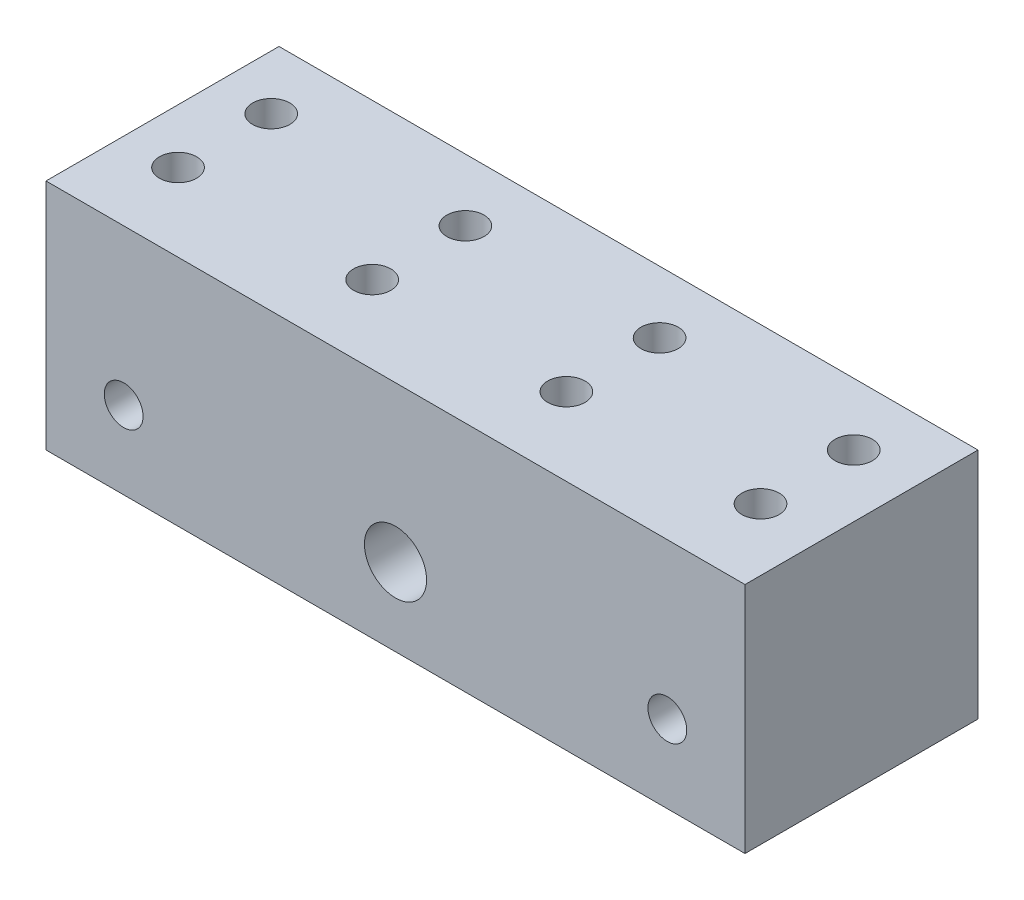
ISO-10303-21;
HEADER;
FILE_DESCRIPTION(('STEP AP214'),'2;1');
FILE_NAME('part.step','',(''),(''),'','','');
FILE_SCHEMA(('AUTOMOTIVE_DESIGN { 1 0 10303 214 1 1 1 1 }'));
ENDSEC;
DATA;
#1=APPLICATION_CONTEXT('core data for automotive mechanical design processes');
#2=APPLICATION_PROTOCOL_DEFINITION('international standard','automotive_design',2000,#1);
#3=PRODUCT_CONTEXT('',#1,'mechanical');
#4=PRODUCT('Part','Part','',(#3));
#5=PRODUCT_RELATED_PRODUCT_CATEGORY('part','',(#4));
#6=PRODUCT_DEFINITION_FORMATION('','',#4);
#7=PRODUCT_DEFINITION_CONTEXT('part definition',#1,'design');
#8=PRODUCT_DEFINITION('design','',#6,#7);
#9=PRODUCT_DEFINITION_SHAPE('','',#8);
#10=(LENGTH_UNIT() NAMED_UNIT(*) SI_UNIT(.MILLI.,.METRE.));
#11=(NAMED_UNIT(*) PLANE_ANGLE_UNIT() SI_UNIT($,.RADIAN.));
#12=(NAMED_UNIT(*) SI_UNIT($,.STERADIAN.) SOLID_ANGLE_UNIT());
#13=UNCERTAINTY_MEASURE_WITH_UNIT(LENGTH_MEASURE(1.E-05),#10,'distance_accuracy_value','');
#14=(GEOMETRIC_REPRESENTATION_CONTEXT(3) GLOBAL_UNCERTAINTY_ASSIGNED_CONTEXT((#13)) GLOBAL_UNIT_ASSIGNED_CONTEXT((#10,
#11,#12)) REPRESENTATION_CONTEXT('',''));
#15=CARTESIAN_POINT('',(0.,0.,0.));
#16=DIRECTION('',(0.,0.,1.));
#17=DIRECTION('',(1.,0.,0.));
#18=AXIS2_PLACEMENT_3D('',#15,#16,#17);
#19=CARTESIAN_POINT('',(0.,0.,30.));
#20=DIRECTION('',(0.,0.,-1.));
#21=DIRECTION('',(-1.,0.,0.));
#22=AXIS2_PLACEMENT_3D('',#19,#20,#21);
#23=PLANE('',#22);
#24=DIRECTION('',(0.,-1.,0.));
#25=VECTOR('',#24,1.);
#26=CARTESIAN_POINT('',(0.,0.,30.));
#27=LINE('',#26,#25);
#28=CARTESIAN_POINT('',(0.,30.,30.));
#29=VERTEX_POINT('',#28);
#30=CARTESIAN_POINT('',(0.,0.,30.));
#31=VERTEX_POINT('',#30);
#32=EDGE_CURVE('E94',#29,#31,#27,.T.);
#33=ORIENTED_EDGE('',*,*,#32,.T.);
#34=DIRECTION('',(1.,0.,0.));
#35=VECTOR('',#34,1.);
#36=CARTESIAN_POINT('',(0.,0.,30.));
#37=LINE('',#36,#35);
#38=CARTESIAN_POINT('',(90.,0.,30.));
#39=VERTEX_POINT('',#38);
#40=EDGE_CURVE('E89',#31,#39,#37,.T.);
#41=ORIENTED_EDGE('',*,*,#40,.T.);
#42=DIRECTION('',(0.,1.,0.));
#43=VECTOR('',#42,1.);
#44=CARTESIAN_POINT('',(90.,0.,30.));
#45=LINE('',#44,#43);
#46=CARTESIAN_POINT('',(90.,30.,30.));
#47=VERTEX_POINT('',#46);
#48=EDGE_CURVE('E92',#39,#47,#45,.T.);
#49=ORIENTED_EDGE('',*,*,#48,.T.);
#50=DIRECTION('',(-1.,0.,0.));
#51=VECTOR('',#50,1.);
#52=CARTESIAN_POINT('',(0.,30.,30.));
#53=LINE('',#52,#51);
#54=EDGE_CURVE('E59',#47,#29,#53,.T.);
#55=ORIENTED_EDGE('',*,*,#54,.T.);
#56=EDGE_LOOP('',(#33,#41,#49,#55));
#57=FACE_BOUND('',#56,.T.);
#58=CARTESIAN_POINT('',(10.,10.,30.));
#59=DIRECTION('',(0.,0.,1.));
#60=DIRECTION('',(1.,0.,0.));
#61=AXIS2_PLACEMENT_3D('',#58,#59,#60);
#62=CIRCLE('',#61,2.5);
#63=CARTESIAN_POINT('',(12.5,10.,30.));
#64=VERTEX_POINT('',#63);
#65=EDGE_CURVE('E114',#64,#64,#62,.T.);
#66=ORIENTED_EDGE('',*,*,#65,.F.);
#67=EDGE_LOOP('',(#66));
#68=FACE_BOUND('',#67,.T.);
#69=CARTESIAN_POINT('',(45.,10.,30.));
#70=DIRECTION('',(0.,0.,1.));
#71=DIRECTION('',(1.,0.,0.));
#72=AXIS2_PLACEMENT_3D('',#69,#70,#71);
#73=CIRCLE('',#72,4.00000000000001);
#74=CARTESIAN_POINT('',(49.,10.,30.));
#75=VERTEX_POINT('',#74);
#76=EDGE_CURVE('E136',#75,#75,#73,.T.);
#77=ORIENTED_EDGE('',*,*,#76,.F.);
#78=EDGE_LOOP('',(#77));
#79=FACE_BOUND('',#78,.T.);
#80=CARTESIAN_POINT('',(80.,10.,30.));
#81=DIRECTION('',(0.,0.,1.));
#82=DIRECTION('',(1.,0.,0.));
#83=AXIS2_PLACEMENT_3D('',#80,#81,#82);
#84=CIRCLE('',#83,2.50000000000001);
#85=CARTESIAN_POINT('',(82.5,10.,30.));
#86=VERTEX_POINT('',#85);
#87=EDGE_CURVE('E144',#86,#86,#84,.T.);
#88=ORIENTED_EDGE('',*,*,#87,.F.);
#89=EDGE_LOOP('',(#88));
#90=FACE_BOUND('',#89,.T.);
#91=ADVANCED_FACE('F41',(#57,#68,#79,#90),#23,.F.);
#92=CARTESIAN_POINT('',(0.,0.,0.));
#93=DIRECTION('',(0.,0.,-1.));
#94=DIRECTION('',(-1.,0.,0.));
#95=AXIS2_PLACEMENT_3D('',#92,#93,#94);
#96=PLANE('',#95);
#97=CARTESIAN_POINT('',(45.,10.,0.));
#98=DIRECTION('',(0.,0.,1.));
#99=DIRECTION('',(1.,0.,0.));
#100=AXIS2_PLACEMENT_3D('',#97,#98,#99);
#101=CIRCLE('',#100,4.00000000000001);
#102=CARTESIAN_POINT('',(49.,10.,0.));
#103=VERTEX_POINT('',#102);
#104=EDGE_CURVE('E140',#103,#103,#101,.T.);
#105=ORIENTED_EDGE('',*,*,#104,.T.);
#106=EDGE_LOOP('',(#105));
#107=FACE_BOUND('',#106,.T.);
#108=DIRECTION('',(0.,-1.,0.));
#109=VECTOR('',#108,1.);
#110=CARTESIAN_POINT('',(0.,0.,0.));
#111=LINE('',#110,#109);
#112=CARTESIAN_POINT('',(0.,30.,0.));
#113=VERTEX_POINT('',#112);
#114=CARTESIAN_POINT('',(0.,0.,0.));
#115=VERTEX_POINT('',#114);
#116=EDGE_CURVE('E110',#113,#115,#111,.T.);
#117=ORIENTED_EDGE('',*,*,#116,.F.);
#118=DIRECTION('',(-1.,0.,0.));
#119=VECTOR('',#118,1.);
#120=CARTESIAN_POINT('',(0.,30.,0.));
#121=LINE('',#120,#119);
#122=CARTESIAN_POINT('',(90.,30.,0.));
#123=VERTEX_POINT('',#122);
#124=EDGE_CURVE('E82',#123,#113,#121,.T.);
#125=ORIENTED_EDGE('',*,*,#124,.F.);
#126=DIRECTION('',(0.,1.,0.));
#127=VECTOR('',#126,1.);
#128=CARTESIAN_POINT('',(90.,0.,0.));
#129=LINE('',#128,#127);
#130=CARTESIAN_POINT('',(90.,0.,0.));
#131=VERTEX_POINT('',#130);
#132=EDGE_CURVE('E76',#131,#123,#129,.T.);
#133=ORIENTED_EDGE('',*,*,#132,.F.);
#134=DIRECTION('',(1.,0.,0.));
#135=VECTOR('',#134,1.);
#136=CARTESIAN_POINT('',(0.,0.,0.));
#137=LINE('',#136,#135);
#138=EDGE_CURVE('E99',#115,#131,#137,.T.);
#139=ORIENTED_EDGE('',*,*,#138,.F.);
#140=EDGE_LOOP('',(#117,#125,#133,#139));
#141=FACE_BOUND('',#140,.T.);
#142=CARTESIAN_POINT('',(10.,10.,0.));
#143=DIRECTION('',(0.,0.,1.));
#144=DIRECTION('',(1.,0.,0.));
#145=AXIS2_PLACEMENT_3D('',#142,#143,#144);
#146=CIRCLE('',#145,2.5);
#147=CARTESIAN_POINT('',(12.5,10.,0.));
#148=VERTEX_POINT('',#147);
#149=EDGE_CURVE('E132',#148,#148,#146,.T.);
#150=ORIENTED_EDGE('',*,*,#149,.T.);
#151=EDGE_LOOP('',(#150));
#152=FACE_BOUND('',#151,.T.);
#153=CARTESIAN_POINT('',(80.,10.,0.));
#154=DIRECTION('',(0.,0.,1.));
#155=DIRECTION('',(1.,0.,0.));
#156=AXIS2_PLACEMENT_3D('',#153,#154,#155);
#157=CIRCLE('',#156,2.50000000000001);
#158=CARTESIAN_POINT('',(82.5,10.,0.));
#159=VERTEX_POINT('',#158);
#160=EDGE_CURVE('E148',#159,#159,#157,.T.);
#161=ORIENTED_EDGE('',*,*,#160,.T.);
#162=EDGE_LOOP('',(#161));
#163=FACE_BOUND('',#162,.T.);
#164=ADVANCED_FACE('F127',(#107,#141,#152,#163),#96,.T.);
#165=CARTESIAN_POINT('',(0.,0.,30.));
#166=DIRECTION('',(1.,0.,0.));
#167=DIRECTION('',(0.,0.,-1.));
#168=AXIS2_PLACEMENT_3D('',#165,#166,#167);
#169=PLANE('',#168);
#170=ORIENTED_EDGE('',*,*,#116,.T.);
#171=DIRECTION('',(0.,0.,-1.));
#172=VECTOR('',#171,1.);
#173=CARTESIAN_POINT('',(0.,0.,30.));
#174=LINE('',#173,#172);
#175=EDGE_CURVE('E11',#31,#115,#174,.T.);
#176=ORIENTED_EDGE('',*,*,#175,.F.);
#177=ORIENTED_EDGE('',*,*,#32,.F.);
#178=DIRECTION('',(0.,0.,-1.));
#179=VECTOR('',#178,1.);
#180=CARTESIAN_POINT('',(0.,30.,30.));
#181=LINE('',#180,#179);
#182=EDGE_CURVE('E106',#29,#113,#181,.T.);
#183=ORIENTED_EDGE('',*,*,#182,.T.);
#184=EDGE_LOOP('',(#170,#176,#177,#183));
#185=FACE_BOUND('',#184,.T.);
#186=ADVANCED_FACE('F43',(#185),#169,.F.);
#187=CARTESIAN_POINT('',(0.,0.,30.));
#188=DIRECTION('',(0.,1.,0.));
#189=DIRECTION('',(0.,0.,1.));
#190=AXIS2_PLACEMENT_3D('',#187,#188,#189);
#191=PLANE('',#190);
#192=ORIENTED_EDGE('',*,*,#138,.T.);
#193=DIRECTION('',(0.,0.,-1.));
#194=VECTOR('',#193,1.);
#195=CARTESIAN_POINT('',(90.,0.,30.));
#196=LINE('',#195,#194);
#197=EDGE_CURVE('E51',#39,#131,#196,.T.);
#198=ORIENTED_EDGE('',*,*,#197,.F.);
#199=ORIENTED_EDGE('',*,*,#40,.F.);
#200=ORIENTED_EDGE('',*,*,#175,.T.);
#201=EDGE_LOOP('',(#192,#198,#199,#200));
#202=FACE_BOUND('',#201,.T.);
#203=ADVANCED_FACE('F98',(#202),#191,.F.);
#204=CARTESIAN_POINT('',(90.,0.,30.));
#205=DIRECTION('',(-1.,0.,0.));
#206=DIRECTION('',(0.,0.,1.));
#207=AXIS2_PLACEMENT_3D('',#204,#205,#206);
#208=PLANE('',#207);
#209=ORIENTED_EDGE('',*,*,#132,.T.);
#210=DIRECTION('',(0.,0.,-1.));
#211=VECTOR('',#210,1.);
#212=CARTESIAN_POINT('',(90.,30.,30.));
#213=LINE('',#212,#211);
#214=EDGE_CURVE('E101',#47,#123,#213,.T.);
#215=ORIENTED_EDGE('',*,*,#214,.F.);
#216=ORIENTED_EDGE('',*,*,#48,.F.);
#217=ORIENTED_EDGE('',*,*,#197,.T.);
#218=EDGE_LOOP('',(#209,#215,#216,#217));
#219=FACE_BOUND('',#218,.T.);
#220=ADVANCED_FACE('F102',(#219),#208,.F.);
#221=CARTESIAN_POINT('',(0.,30.,30.));
#222=DIRECTION('',(0.,-1.,0.));
#223=DIRECTION('',(0.,0.,-1.));
#224=AXIS2_PLACEMENT_3D('',#221,#222,#223);
#225=PLANE('',#224);
#226=CARTESIAN_POINT('',(32.,30.,20.));
#227=DIRECTION('',(0.,1.,0.));
#228=DIRECTION('',(0.,0.,1.));
#229=AXIS2_PLACEMENT_3D('',#226,#227,#228);
#230=CIRCLE('',#229,2.4);
#231=CARTESIAN_POINT('',(32.,30.,22.4));
#232=VERTEX_POINT('',#231);
#233=EDGE_CURVE('E180',#232,#232,#230,.T.);
#234=ORIENTED_EDGE('',*,*,#233,.F.);
#235=EDGE_LOOP('',(#234));
#236=FACE_BOUND('',#235,.T.);
#237=CARTESIAN_POINT('',(82.,30.,8.));
#238=DIRECTION('',(0.,1.,0.));
#239=DIRECTION('',(0.,0.,1.));
#240=AXIS2_PLACEMENT_3D('',#237,#238,#239);
#241=CIRCLE('',#240,2.4);
#242=CARTESIAN_POINT('',(82.,30.,10.4));
#243=VERTEX_POINT('',#242);
#244=EDGE_CURVE('E189',#243,#243,#241,.T.);
#245=ORIENTED_EDGE('',*,*,#244,.F.);
#246=EDGE_LOOP('',(#245));
#247=FACE_BOUND('',#246,.T.);
#248=CARTESIAN_POINT('',(57.,30.,8.));
#249=DIRECTION('',(0.,1.,0.));
#250=DIRECTION('',(0.,0.,1.));
#251=AXIS2_PLACEMENT_3D('',#248,#249,#250);
#252=CIRCLE('',#251,2.4);
#253=CARTESIAN_POINT('',(57.,30.,10.4));
#254=VERTEX_POINT('',#253);
#255=EDGE_CURVE('E164',#254,#254,#252,.T.);
#256=ORIENTED_EDGE('',*,*,#255,.F.);
#257=EDGE_LOOP('',(#256));
#258=FACE_BOUND('',#257,.T.);
#259=CARTESIAN_POINT('',(32.,30.,8.));
#260=DIRECTION('',(0.,1.,0.));
#261=DIRECTION('',(0.,0.,1.));
#262=AXIS2_PLACEMENT_3D('',#259,#260,#261);
#263=CIRCLE('',#262,2.4);
#264=CARTESIAN_POINT('',(32.,30.,10.4));
#265=VERTEX_POINT('',#264);
#266=EDGE_CURVE('E173',#265,#265,#263,.T.);
#267=ORIENTED_EDGE('',*,*,#266,.F.);
#268=EDGE_LOOP('',(#267));
#269=FACE_BOUND('',#268,.T.);
#270=CARTESIAN_POINT('',(57.,30.,20.));
#271=DIRECTION('',(0.,1.,0.));
#272=DIRECTION('',(0.,0.,1.));
#273=AXIS2_PLACEMENT_3D('',#270,#271,#272);
#274=CIRCLE('',#273,2.4);
#275=CARTESIAN_POINT('',(57.,30.,22.4));
#276=VERTEX_POINT('',#275);
#277=EDGE_CURVE('E212',#276,#276,#274,.T.);
#278=ORIENTED_EDGE('',*,*,#277,.F.);
#279=EDGE_LOOP('',(#278));
#280=FACE_BOUND('',#279,.T.);
#281=CARTESIAN_POINT('',(82.,30.,20.));
#282=DIRECTION('',(0.,1.,0.));
#283=DIRECTION('',(0.,0.,1.));
#284=AXIS2_PLACEMENT_3D('',#281,#282,#283);
#285=CIRCLE('',#284,2.4);
#286=CARTESIAN_POINT('',(82.,30.,22.4));
#287=VERTEX_POINT('',#286);
#288=EDGE_CURVE('E204',#287,#287,#285,.T.);
#289=ORIENTED_EDGE('',*,*,#288,.F.);
#290=EDGE_LOOP('',(#289));
#291=FACE_BOUND('',#290,.T.);
#292=CARTESIAN_POINT('',(7.00000000000001,30.,20.));
#293=DIRECTION('',(0.,1.,0.));
#294=DIRECTION('',(0.,0.,1.));
#295=AXIS2_PLACEMENT_3D('',#292,#293,#294);
#296=CIRCLE('',#295,2.4);
#297=CARTESIAN_POINT('',(7.00000000000001,30.,22.4));
#298=VERTEX_POINT('',#297);
#299=EDGE_CURVE('E196',#298,#298,#296,.T.);
#300=ORIENTED_EDGE('',*,*,#299,.F.);
#301=EDGE_LOOP('',(#300));
#302=FACE_BOUND('',#301,.T.);
#303=CARTESIAN_POINT('',(7.00000000000001,30.,8.));
#304=DIRECTION('',(0.,1.,0.));
#305=DIRECTION('',(0.,0.,1.));
#306=AXIS2_PLACEMENT_3D('',#303,#304,#305);
#307=CIRCLE('',#306,2.4);
#308=CARTESIAN_POINT('',(7.00000000000001,30.,10.4));
#309=VERTEX_POINT('',#308);
#310=EDGE_CURVE('E156',#309,#309,#307,.T.);
#311=ORIENTED_EDGE('',*,*,#310,.F.);
#312=EDGE_LOOP('',(#311));
#313=FACE_BOUND('',#312,.T.);
#314=ORIENTED_EDGE('',*,*,#124,.T.);
#315=ORIENTED_EDGE('',*,*,#182,.F.);
#316=ORIENTED_EDGE('',*,*,#54,.F.);
#317=ORIENTED_EDGE('',*,*,#214,.T.);
#318=EDGE_LOOP('',(#314,#315,#316,#317));
#319=FACE_BOUND('',#318,.T.);
#320=ADVANCED_FACE('F124',(#236,#247,#258,#269,#280,#291,#302,#313,#319),#225,.F.);
#321=CARTESIAN_POINT('',(10.,10.,30.));
#322=DIRECTION('',(0.,0.,-1.));
#323=DIRECTION('',(-1.,0.,0.));
#324=AXIS2_PLACEMENT_3D('',#321,#322,#323);
#325=CYLINDRICAL_SURFACE('',#324,2.5);
#326=ORIENTED_EDGE('',*,*,#65,.T.);
#327=EDGE_LOOP('',(#326));
#328=FACE_BOUND('',#327,.T.);
#329=ORIENTED_EDGE('',*,*,#149,.F.);
#330=EDGE_LOOP('',(#329));
#331=FACE_BOUND('',#330,.T.);
#332=ADVANCED_FACE('F231',(#328,#331),#325,.F.);
#333=CARTESIAN_POINT('',(45.,10.,30.));
#334=DIRECTION('',(0.,0.,-1.));
#335=DIRECTION('',(-1.,0.,0.));
#336=AXIS2_PLACEMENT_3D('',#333,#334,#335);
#337=CYLINDRICAL_SURFACE('',#336,4.00000000000001);
#338=ORIENTED_EDGE('',*,*,#76,.T.);
#339=EDGE_LOOP('',(#338));
#340=FACE_BOUND('',#339,.T.);
#341=ORIENTED_EDGE('',*,*,#104,.F.);
#342=EDGE_LOOP('',(#341));
#343=FACE_BOUND('',#342,.T.);
#344=ADVANCED_FACE('F253',(#340,#343),#337,.F.);
#345=CARTESIAN_POINT('',(80.,10.,30.));
#346=DIRECTION('',(0.,0.,-1.));
#347=DIRECTION('',(-1.,0.,0.));
#348=AXIS2_PLACEMENT_3D('',#345,#346,#347);
#349=CYLINDRICAL_SURFACE('',#348,2.50000000000001);
#350=ORIENTED_EDGE('',*,*,#87,.T.);
#351=EDGE_LOOP('',(#350));
#352=FACE_BOUND('',#351,.T.);
#353=ORIENTED_EDGE('',*,*,#160,.F.);
#354=EDGE_LOOP('',(#353));
#355=FACE_BOUND('',#354,.T.);
#356=ADVANCED_FACE('F243',(#352,#355),#349,.F.);
#357=CARTESIAN_POINT('',(7.00000000000001,25.,8.));
#358=DIRECTION('',(0.,1.,0.));
#359=DIRECTION('',(0.,0.,1.));
#360=AXIS2_PLACEMENT_3D('',#357,#358,#359);
#361=CYLINDRICAL_SURFACE('',#360,2.4);
#362=CARTESIAN_POINT('',(7.00000000000001,25.,8.));
#363=DIRECTION('',(0.,1.,0.));
#364=DIRECTION('',(0.,0.,1.));
#365=AXIS2_PLACEMENT_3D('',#362,#363,#364);
#366=CIRCLE('',#365,2.4);
#367=CARTESIAN_POINT('',(7.00000000000001,25.,10.4));
#368=VERTEX_POINT('',#367);
#369=EDGE_CURVE('E152',#368,#368,#366,.T.);
#370=ORIENTED_EDGE('',*,*,#369,.F.);
#371=EDGE_LOOP('',(#370));
#372=FACE_BOUND('',#371,.T.);
#373=ORIENTED_EDGE('',*,*,#310,.T.);
#374=EDGE_LOOP('',(#373));
#375=FACE_BOUND('',#374,.T.);
#376=ADVANCED_FACE('F240',(#372,#375),#361,.F.);
#377=CARTESIAN_POINT('',(7.00000000000001,25.,8.));
#378=DIRECTION('',(0.,1.,0.));
#379=DIRECTION('',(0.,0.,1.));
#380=AXIS2_PLACEMENT_3D('',#377,#378,#379);
#381=PLANE('',#380);
#382=ORIENTED_EDGE('',*,*,#369,.T.);
#383=EDGE_LOOP('',(#382));
#384=FACE_BOUND('',#383,.T.);
#385=ADVANCED_FACE('F242',(#384),#381,.T.);
#386=CARTESIAN_POINT('',(7.00000000000001,25.,20.));
#387=DIRECTION('',(0.,1.,0.));
#388=DIRECTION('',(0.,0.,1.));
#389=AXIS2_PLACEMENT_3D('',#386,#387,#388);
#390=CYLINDRICAL_SURFACE('',#389,2.4);
#391=CARTESIAN_POINT('',(7.00000000000001,25.,20.));
#392=DIRECTION('',(0.,1.,0.));
#393=DIRECTION('',(0.,0.,1.));
#394=AXIS2_PLACEMENT_3D('',#391,#392,#393);
#395=CIRCLE('',#394,2.4);
#396=CARTESIAN_POINT('',(7.00000000000001,25.,22.4));
#397=VERTEX_POINT('',#396);
#398=EDGE_CURVE('E200',#397,#397,#395,.T.);
#399=ORIENTED_EDGE('',*,*,#398,.F.);
#400=EDGE_LOOP('',(#399));
#401=FACE_BOUND('',#400,.T.);
#402=ORIENTED_EDGE('',*,*,#299,.T.);
#403=EDGE_LOOP('',(#402));
#404=FACE_BOUND('',#403,.T.);
#405=ADVANCED_FACE('F250',(#401,#404),#390,.F.);
#406=CARTESIAN_POINT('',(7.00000000000001,25.,20.));
#407=DIRECTION('',(0.,1.,0.));
#408=DIRECTION('',(0.,0.,1.));
#409=AXIS2_PLACEMENT_3D('',#406,#407,#408);
#410=PLANE('',#409);
#411=ORIENTED_EDGE('',*,*,#398,.T.);
#412=EDGE_LOOP('',(#411));
#413=FACE_BOUND('',#412,.T.);
#414=ADVANCED_FACE('F350',(#413),#410,.T.);
#415=CARTESIAN_POINT('',(82.,25.,20.));
#416=DIRECTION('',(0.,1.,0.));
#417=DIRECTION('',(0.,0.,1.));
#418=AXIS2_PLACEMENT_3D('',#415,#416,#417);
#419=CYLINDRICAL_SURFACE('',#418,2.4);
#420=CARTESIAN_POINT('',(82.,25.,20.));
#421=DIRECTION('',(0.,1.,0.));
#422=DIRECTION('',(0.,0.,1.));
#423=AXIS2_PLACEMENT_3D('',#420,#421,#422);
#424=CIRCLE('',#423,2.4);
#425=CARTESIAN_POINT('',(82.,25.,22.4));
#426=VERTEX_POINT('',#425);
#427=EDGE_CURVE('E208',#426,#426,#424,.T.);
#428=ORIENTED_EDGE('',*,*,#427,.F.);
#429=EDGE_LOOP('',(#428));
#430=FACE_BOUND('',#429,.T.);
#431=ORIENTED_EDGE('',*,*,#288,.T.);
#432=EDGE_LOOP('',(#431));
#433=FACE_BOUND('',#432,.T.);
#434=ADVANCED_FACE('F360',(#430,#433),#419,.F.);
#435=CARTESIAN_POINT('',(82.,25.,20.));
#436=DIRECTION('',(0.,1.,0.));
#437=DIRECTION('',(0.,0.,1.));
#438=AXIS2_PLACEMENT_3D('',#435,#436,#437);
#439=PLANE('',#438);
#440=ORIENTED_EDGE('',*,*,#427,.T.);
#441=EDGE_LOOP('',(#440));
#442=FACE_BOUND('',#441,.T.);
#443=ADVANCED_FACE('F225',(#442),#439,.T.);
#444=CARTESIAN_POINT('',(57.,25.,20.));
#445=DIRECTION('',(0.,1.,0.));
#446=DIRECTION('',(0.,0.,1.));
#447=AXIS2_PLACEMENT_3D('',#444,#445,#446);
#448=CYLINDRICAL_SURFACE('',#447,2.4);
#449=CARTESIAN_POINT('',(57.,25.,20.));
#450=DIRECTION('',(0.,1.,0.));
#451=DIRECTION('',(0.,0.,1.));
#452=AXIS2_PLACEMENT_3D('',#449,#450,#451);
#453=CIRCLE('',#452,2.4);
#454=CARTESIAN_POINT('',(57.,25.,22.4));
#455=VERTEX_POINT('',#454);
#456=EDGE_CURVE('E185',#455,#455,#453,.T.);
#457=ORIENTED_EDGE('',*,*,#456,.F.);
#458=EDGE_LOOP('',(#457));
#459=FACE_BOUND('',#458,.T.);
#460=ORIENTED_EDGE('',*,*,#277,.T.);
#461=EDGE_LOOP('',(#460));
#462=FACE_BOUND('',#461,.T.);
#463=ADVANCED_FACE('F222',(#459,#462),#448,.F.);
#464=CARTESIAN_POINT('',(57.,25.,20.));
#465=DIRECTION('',(0.,1.,0.));
#466=DIRECTION('',(0.,0.,1.));
#467=AXIS2_PLACEMENT_3D('',#464,#465,#466);
#468=PLANE('',#467);
#469=ORIENTED_EDGE('',*,*,#456,.T.);
#470=EDGE_LOOP('',(#469));
#471=FACE_BOUND('',#470,.T.);
#472=ADVANCED_FACE('F220',(#471),#468,.T.);
#473=CARTESIAN_POINT('',(32.,25.,8.));
#474=DIRECTION('',(0.,1.,0.));
#475=DIRECTION('',(0.,0.,1.));
#476=AXIS2_PLACEMENT_3D('',#473,#474,#475);
#477=CYLINDRICAL_SURFACE('',#476,2.4);
#478=CARTESIAN_POINT('',(32.,25.,8.));
#479=DIRECTION('',(0.,1.,0.));
#480=DIRECTION('',(0.,0.,1.));
#481=AXIS2_PLACEMENT_3D('',#478,#479,#480);
#482=CIRCLE('',#481,2.4);
#483=CARTESIAN_POINT('',(32.,25.,10.4));
#484=VERTEX_POINT('',#483);
#485=EDGE_CURVE('E160',#484,#484,#482,.T.);
#486=ORIENTED_EDGE('',*,*,#485,.F.);
#487=EDGE_LOOP('',(#486));
#488=FACE_BOUND('',#487,.T.);
#489=ORIENTED_EDGE('',*,*,#266,.T.);
#490=EDGE_LOOP('',(#489));
#491=FACE_BOUND('',#490,.T.);
#492=ADVANCED_FACE('F394',(#488,#491),#477,.F.);
#493=CARTESIAN_POINT('',(32.,25.,8.));
#494=DIRECTION('',(0.,1.,0.));
#495=DIRECTION('',(0.,0.,1.));
#496=AXIS2_PLACEMENT_3D('',#493,#494,#495);
#497=PLANE('',#496);
#498=ORIENTED_EDGE('',*,*,#485,.T.);
#499=EDGE_LOOP('',(#498));
#500=FACE_BOUND('',#499,.T.);
#501=ADVANCED_FACE('F403',(#500),#497,.T.);
#502=CARTESIAN_POINT('',(57.,25.,8.));
#503=DIRECTION('',(0.,1.,0.));
#504=DIRECTION('',(0.,0.,1.));
#505=AXIS2_PLACEMENT_3D('',#502,#503,#504);
#506=CYLINDRICAL_SURFACE('',#505,2.4);
#507=CARTESIAN_POINT('',(57.,25.,8.));
#508=DIRECTION('',(0.,1.,0.));
#509=DIRECTION('',(0.,0.,1.));
#510=AXIS2_PLACEMENT_3D('',#507,#508,#509);
#511=CIRCLE('',#510,2.4);
#512=CARTESIAN_POINT('',(57.,25.,10.4));
#513=VERTEX_POINT('',#512);
#514=EDGE_CURVE('E168',#513,#513,#511,.T.);
#515=ORIENTED_EDGE('',*,*,#514,.F.);
#516=EDGE_LOOP('',(#515));
#517=FACE_BOUND('',#516,.T.);
#518=ORIENTED_EDGE('',*,*,#255,.T.);
#519=EDGE_LOOP('',(#518));
#520=FACE_BOUND('',#519,.T.);
#521=ADVANCED_FACE('F413',(#517,#520),#506,.F.);
#522=CARTESIAN_POINT('',(57.,25.,8.));
#523=DIRECTION('',(0.,1.,0.));
#524=DIRECTION('',(0.,0.,1.));
#525=AXIS2_PLACEMENT_3D('',#522,#523,#524);
#526=PLANE('',#525);
#527=ORIENTED_EDGE('',*,*,#514,.T.);
#528=EDGE_LOOP('',(#527));
#529=FACE_BOUND('',#528,.T.);
#530=ADVANCED_FACE('F423',(#529),#526,.T.);
#531=CARTESIAN_POINT('',(82.,25.,8.));
#532=DIRECTION('',(0.,1.,0.));
#533=DIRECTION('',(0.,0.,1.));
#534=AXIS2_PLACEMENT_3D('',#531,#532,#533);
#535=CYLINDRICAL_SURFACE('',#534,2.4);
#536=CARTESIAN_POINT('',(82.,25.,8.));
#537=DIRECTION('',(0.,1.,0.));
#538=DIRECTION('',(0.,0.,1.));
#539=AXIS2_PLACEMENT_3D('',#536,#537,#538);
#540=CIRCLE('',#539,2.4);
#541=CARTESIAN_POINT('',(82.,25.,10.4));
#542=VERTEX_POINT('',#541);
#543=EDGE_CURVE('E169',#542,#542,#540,.T.);
#544=ORIENTED_EDGE('',*,*,#543,.F.);
#545=EDGE_LOOP('',(#544));
#546=FACE_BOUND('',#545,.T.);
#547=ORIENTED_EDGE('',*,*,#244,.T.);
#548=EDGE_LOOP('',(#547));
#549=FACE_BOUND('',#548,.T.);
#550=ADVANCED_FACE('F433',(#546,#549),#535,.F.);
#551=CARTESIAN_POINT('',(82.,25.,8.));
#552=DIRECTION('',(0.,1.,0.));
#553=DIRECTION('',(0.,0.,1.));
#554=AXIS2_PLACEMENT_3D('',#551,#552,#553);
#555=PLANE('',#554);
#556=ORIENTED_EDGE('',*,*,#543,.T.);
#557=EDGE_LOOP('',(#556));
#558=FACE_BOUND('',#557,.T.);
#559=ADVANCED_FACE('F443',(#558),#555,.T.);
#560=CARTESIAN_POINT('',(32.,25.,20.));
#561=DIRECTION('',(0.,1.,0.));
#562=DIRECTION('',(0.,0.,1.));
#563=AXIS2_PLACEMENT_3D('',#560,#561,#562);
#564=CYLINDRICAL_SURFACE('',#563,2.4);
#565=CARTESIAN_POINT('',(32.,25.,20.));
#566=DIRECTION('',(0.,1.,0.));
#567=DIRECTION('',(0.,0.,1.));
#568=AXIS2_PLACEMENT_3D('',#565,#566,#567);
#569=CIRCLE('',#568,2.4);
#570=CARTESIAN_POINT('',(32.,25.,22.4));
#571=VERTEX_POINT('',#570);
#572=EDGE_CURVE('E184',#571,#571,#569,.T.);
#573=ORIENTED_EDGE('',*,*,#572,.F.);
#574=EDGE_LOOP('',(#573));
#575=FACE_BOUND('',#574,.T.);
#576=ORIENTED_EDGE('',*,*,#233,.T.);
#577=EDGE_LOOP('',(#576));
#578=FACE_BOUND('',#577,.T.);
#579=ADVANCED_FACE('F453',(#575,#578),#564,.F.);
#580=CARTESIAN_POINT('',(32.,25.,20.));
#581=DIRECTION('',(0.,1.,0.));
#582=DIRECTION('',(0.,0.,1.));
#583=AXIS2_PLACEMENT_3D('',#580,#581,#582);
#584=PLANE('',#583);
#585=ORIENTED_EDGE('',*,*,#572,.T.);
#586=EDGE_LOOP('',(#585));
#587=FACE_BOUND('',#586,.T.);
#588=ADVANCED_FACE('F463',(#587),#584,.T.);
#589=CLOSED_SHELL('',(#91,#164,#186,#203,#220,#320,#332,#344,#356,#376,#385,#405,#414,#434,#443,
#463,#472,#492,#501,#521,#530,#550,#559,#579,#588));
#590=MANIFOLD_SOLID_BREP('B2',#589);
#591=ADVANCED_BREP_SHAPE_REPRESENTATION('',(#18,#590),#14);
#592=SHAPE_DEFINITION_REPRESENTATION(#9,#591);
ENDSEC;
END-ISO-10303-21;
